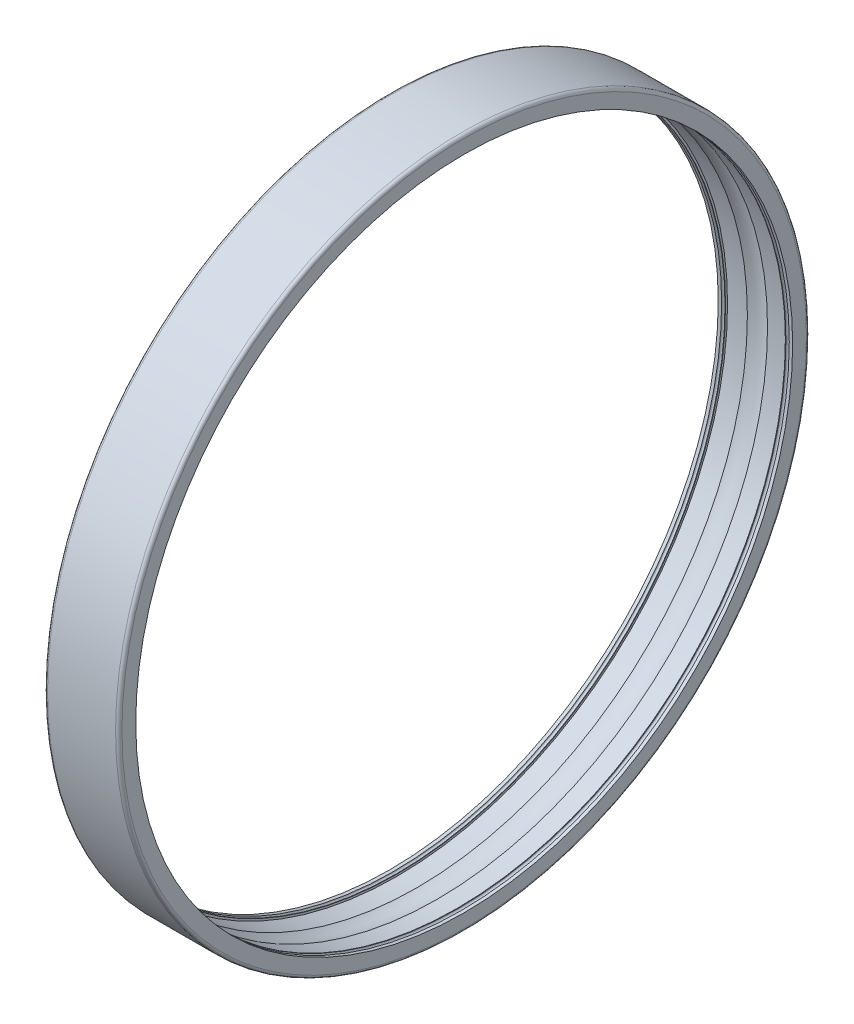
ISO-10303-21;
HEADER;
FILE_DESCRIPTION(('STEP AP214'),'2;1');
FILE_NAME('part.step','',(''),(''),'','','');
FILE_SCHEMA(('AUTOMOTIVE_DESIGN { 1 0 10303 214 1 1 1 1 }'));
ENDSEC;
DATA;
#1=APPLICATION_CONTEXT('core data for automotive mechanical design processes');
#2=APPLICATION_PROTOCOL_DEFINITION('international standard','automotive_design',2000,#1);
#3=PRODUCT_CONTEXT('',#1,'mechanical');
#4=PRODUCT('Part','Part','',(#3));
#5=PRODUCT_RELATED_PRODUCT_CATEGORY('part','',(#4));
#6=PRODUCT_DEFINITION_FORMATION('','',#4);
#7=PRODUCT_DEFINITION_CONTEXT('part definition',#1,'design');
#8=PRODUCT_DEFINITION('design','',#6,#7);
#9=PRODUCT_DEFINITION_SHAPE('','',#8);
#10=(LENGTH_UNIT() NAMED_UNIT(*) SI_UNIT(.MILLI.,.METRE.));
#11=(NAMED_UNIT(*) PLANE_ANGLE_UNIT() SI_UNIT($,.RADIAN.));
#12=(NAMED_UNIT(*) SI_UNIT($,.STERADIAN.) SOLID_ANGLE_UNIT());
#13=UNCERTAINTY_MEASURE_WITH_UNIT(LENGTH_MEASURE(1.E-05),#10,'distance_accuracy_value','');
#14=(GEOMETRIC_REPRESENTATION_CONTEXT(3) GLOBAL_UNCERTAINTY_ASSIGNED_CONTEXT((#13)) GLOBAL_UNIT_ASSIGNED_CONTEXT((#10,
#11,#12)) REPRESENTATION_CONTEXT('',''));
#15=CARTESIAN_POINT('',(0.,0.,0.));
#16=DIRECTION('',(0.,0.,1.));
#17=DIRECTION('',(1.,0.,0.));
#18=AXIS2_PLACEMENT_3D('',#15,#16,#17);
#19=CARTESIAN_POINT('',(0.,32.2,0.));
#20=DIRECTION('',(1.,0.,0.));
#21=DIRECTION('',(0.,0.,-1.));
#22=AXIS2_PLACEMENT_3D('',#19,#20,#21);
#23=PLANE('',#22);
#24=CARTESIAN_POINT('',(0.,0.,0.));
#25=DIRECTION('',(-1.,0.,0.));
#26=DIRECTION('',(0.,0.,1.));
#27=AXIS2_PLACEMENT_3D('',#24,#25,#26);
#28=CIRCLE('',#27,30.9);
#29=CARTESIAN_POINT('',(0.,0.,30.9));
#30=VERTEX_POINT('',#29);
#31=EDGE_CURVE('E9',#30,#30,#28,.T.);
#32=ORIENTED_EDGE('',*,*,#31,.F.);
#33=EDGE_LOOP('',(#32));
#34=FACE_BOUND('',#33,.T.);
#35=CARTESIAN_POINT('',(0.,0.,0.));
#36=DIRECTION('',(-1.,0.,0.));
#37=DIRECTION('',(0.,0.,1.));
#38=AXIS2_PLACEMENT_3D('',#35,#36,#37);
#39=CIRCLE('',#38,32.2);
#40=CARTESIAN_POINT('',(0.,0.,32.2));
#41=VERTEX_POINT('',#40);
#42=EDGE_CURVE('E87',#41,#41,#39,.T.);
#43=ORIENTED_EDGE('',*,*,#42,.T.);
#44=EDGE_LOOP('',(#43));
#45=FACE_BOUND('',#44,.T.);
#46=ADVANCED_FACE('F13',(#34,#45),#23,.F.);
#47=CARTESIAN_POINT('',(3.5,0.,0.));
#48=DIRECTION('',(-1.,0.,0.));
#49=DIRECTION('',(0.,0.,1.));
#50=AXIS2_PLACEMENT_3D('',#47,#48,#49);
#51=CYLINDRICAL_SURFACE('',#50,30.9);
#52=CARTESIAN_POINT('',(0.318181818181818,0.,0.));
#53=DIRECTION('',(-1.,0.,0.));
#54=DIRECTION('',(0.,0.,1.));
#55=AXIS2_PLACEMENT_3D('',#52,#53,#54);
#56=CIRCLE('',#55,30.9);
#57=CARTESIAN_POINT('',(0.318181818181818,0.,30.9));
#58=VERTEX_POINT('',#57);
#59=EDGE_CURVE('E20',#58,#58,#56,.T.);
#60=ORIENTED_EDGE('',*,*,#59,.F.);
#61=EDGE_LOOP('',(#60));
#62=FACE_BOUND('',#61,.T.);
#63=ORIENTED_EDGE('',*,*,#31,.T.);
#64=EDGE_LOOP('',(#63));
#65=FACE_BOUND('',#64,.T.);
#66=ADVANCED_FACE('F136',(#62,#65),#51,.F.);
#67=CARTESIAN_POINT('',(0.477272727272728,0.,0.));
#68=DIRECTION('',(-1.,0.,0.));
#69=DIRECTION('',(0.,0.,1.));
#70=AXIS2_PLACEMENT_3D('',#67,#68,#69);
#71=TOROIDAL_SURFACE('',#70,30.9,0.159090909090909);
#72=ORIENTED_EDGE('',*,*,#59,.T.);
#73=EDGE_LOOP('',(#72));
#74=FACE_BOUND('',#73,.T.);
#75=CARTESIAN_POINT('',(0.636363636363637,0.,0.));
#76=DIRECTION('',(-1.,0.,0.));
#77=DIRECTION('',(0.,0.,1.));
#78=AXIS2_PLACEMENT_3D('',#75,#76,#77);
#79=CIRCLE('',#78,30.9);
#80=CARTESIAN_POINT('',(0.636363636363637,0.,30.9));
#81=VERTEX_POINT('',#80);
#82=EDGE_CURVE('E29',#81,#81,#79,.T.);
#83=ORIENTED_EDGE('',*,*,#82,.F.);
#84=EDGE_LOOP('',(#83));
#85=FACE_BOUND('',#84,.T.);
#86=ADVANCED_FACE('F141',(#74,#85),#71,.F.);
#87=CARTESIAN_POINT('',(3.5,0.,0.));
#88=DIRECTION('',(-1.,0.,0.));
#89=DIRECTION('',(0.,0.,1.));
#90=AXIS2_PLACEMENT_3D('',#87,#88,#89);
#91=CYLINDRICAL_SURFACE('',#90,30.9);
#92=CARTESIAN_POINT('',(0.686363636363637,0.,0.));
#93=DIRECTION('',(-1.,0.,0.));
#94=DIRECTION('',(0.,0.,1.));
#95=AXIS2_PLACEMENT_3D('',#92,#93,#94);
#96=CIRCLE('',#95,30.9);
#97=CARTESIAN_POINT('',(0.686363636363637,0.,30.9));
#98=VERTEX_POINT('',#97);
#99=EDGE_CURVE('E37',#98,#98,#96,.T.);
#100=ORIENTED_EDGE('',*,*,#99,.F.);
#101=EDGE_LOOP('',(#100));
#102=FACE_BOUND('',#101,.T.);
#103=ORIENTED_EDGE('',*,*,#82,.T.);
#104=EDGE_LOOP('',(#103));
#105=FACE_BOUND('',#104,.T.);
#106=ADVANCED_FACE('F146',(#102,#105),#91,.F.);
#107=CARTESIAN_POINT('',(0.686363636363637,30.9,0.));
#108=DIRECTION('',(-1.,0.,0.));
#109=DIRECTION('',(0.,0.,1.));
#110=AXIS2_PLACEMENT_3D('',#107,#108,#109);
#111=PLANE('',#110);
#112=CARTESIAN_POINT('',(0.686363636363637,0.,0.));
#113=DIRECTION('',(-1.,0.,0.));
#114=DIRECTION('',(0.,0.,1.));
#115=AXIS2_PLACEMENT_3D('',#112,#113,#114);
#116=CIRCLE('',#115,31.0886363636364);
#117=CARTESIAN_POINT('',(0.686363636363637,0.,31.0886363636364));
#118=VERTEX_POINT('',#117);
#119=EDGE_CURVE('E43',#118,#118,#116,.T.);
#120=ORIENTED_EDGE('',*,*,#119,.F.);
#121=EDGE_LOOP('',(#120));
#122=FACE_BOUND('',#121,.T.);
#123=ORIENTED_EDGE('',*,*,#99,.T.);
#124=EDGE_LOOP('',(#123));
#125=FACE_BOUND('',#124,.T.);
#126=ADVANCED_FACE('F151',(#122,#125),#111,.F.);
#127=CARTESIAN_POINT('',(3.5,0.,0.));
#128=DIRECTION('',(-1.,0.,0.));
#129=DIRECTION('',(0.,0.,1.));
#130=AXIS2_PLACEMENT_3D('',#127,#128,#129);
#131=CYLINDRICAL_SURFACE('',#130,31.0886363636364);
#132=CARTESIAN_POINT('',(2.55285334986629,0.,0.));
#133=DIRECTION('',(-1.,0.,0.));
#134=DIRECTION('',(0.,0.,1.));
#135=AXIS2_PLACEMENT_3D('',#132,#133,#134);
#136=CIRCLE('',#135,31.0886363636364);
#137=CARTESIAN_POINT('',(2.55285334986629,0.,31.0886363636364));
#138=VERTEX_POINT('',#137);
#139=EDGE_CURVE('E47',#138,#138,#136,.T.);
#140=ORIENTED_EDGE('',*,*,#139,.F.);
#141=EDGE_LOOP('',(#140));
#142=FACE_BOUND('',#141,.T.);
#143=ORIENTED_EDGE('',*,*,#119,.T.);
#144=EDGE_LOOP('',(#143));
#145=FACE_BOUND('',#144,.T.);
#146=ADVANCED_FACE('F155',(#142,#145),#131,.F.);
#147=CARTESIAN_POINT('',(3.5,0.,0.));
#148=DIRECTION('',(-1.,0.,0.));
#149=DIRECTION('',(0.,0.,1.));
#150=AXIS2_PLACEMENT_3D('',#147,#148,#149);
#151=TOROIDAL_SURFACE('',#150,28.775,2.5);
#152=ORIENTED_EDGE('',*,*,#139,.T.);
#153=EDGE_LOOP('',(#152));
#154=FACE_BOUND('',#153,.T.);
#155=CARTESIAN_POINT('',(4.44714665013371,0.,0.));
#156=DIRECTION('',(-1.,0.,0.));
#157=DIRECTION('',(0.,0.,1.));
#158=AXIS2_PLACEMENT_3D('',#155,#156,#157);
#159=CIRCLE('',#158,31.0886363636364);
#160=CARTESIAN_POINT('',(4.44714665013371,0.,31.0886363636364));
#161=VERTEX_POINT('',#160);
#162=EDGE_CURVE('E51',#161,#161,#159,.T.);
#163=ORIENTED_EDGE('',*,*,#162,.F.);
#164=EDGE_LOOP('',(#163));
#165=FACE_BOUND('',#164,.T.);
#166=ADVANCED_FACE('F159',(#154,#165),#151,.F.);
#167=CARTESIAN_POINT('',(3.5,0.,0.));
#168=DIRECTION('',(-1.,0.,0.));
#169=DIRECTION('',(0.,0.,1.));
#170=AXIS2_PLACEMENT_3D('',#167,#168,#169);
#171=CYLINDRICAL_SURFACE('',#170,31.0886363636364);
#172=CARTESIAN_POINT('',(6.31363636363637,0.,0.));
#173=DIRECTION('',(-1.,0.,0.));
#174=DIRECTION('',(0.,0.,1.));
#175=AXIS2_PLACEMENT_3D('',#172,#173,#174);
#176=CIRCLE('',#175,31.0886363636364);
#177=CARTESIAN_POINT('',(6.31363636363637,0.,31.0886363636364));
#178=VERTEX_POINT('',#177);
#179=EDGE_CURVE('E55',#178,#178,#176,.T.);
#180=ORIENTED_EDGE('',*,*,#179,.F.);
#181=EDGE_LOOP('',(#180));
#182=FACE_BOUND('',#181,.T.);
#183=ORIENTED_EDGE('',*,*,#162,.T.);
#184=EDGE_LOOP('',(#183));
#185=FACE_BOUND('',#184,.T.);
#186=ADVANCED_FACE('F163',(#182,#185),#171,.F.);
#187=CARTESIAN_POINT('',(6.31363636363637,31.0886363636364,0.));
#188=DIRECTION('',(1.,0.,0.));
#189=DIRECTION('',(0.,0.,-1.));
#190=AXIS2_PLACEMENT_3D('',#187,#188,#189);
#191=PLANE('',#190);
#192=CARTESIAN_POINT('',(6.31363636363636,0.,0.));
#193=DIRECTION('',(-1.,0.,0.));
#194=DIRECTION('',(0.,0.,1.));
#195=AXIS2_PLACEMENT_3D('',#192,#193,#194);
#196=CIRCLE('',#195,30.9);
#197=CARTESIAN_POINT('',(6.31363636363636,0.,30.9));
#198=VERTEX_POINT('',#197);
#199=EDGE_CURVE('E59',#198,#198,#196,.T.);
#200=ORIENTED_EDGE('',*,*,#199,.F.);
#201=EDGE_LOOP('',(#200));
#202=FACE_BOUND('',#201,.T.);
#203=ORIENTED_EDGE('',*,*,#179,.T.);
#204=EDGE_LOOP('',(#203));
#205=FACE_BOUND('',#204,.T.);
#206=ADVANCED_FACE('F132',(#202,#205),#191,.F.);
#207=CARTESIAN_POINT('',(3.5,0.,0.));
#208=DIRECTION('',(-1.,0.,0.));
#209=DIRECTION('',(0.,0.,1.));
#210=AXIS2_PLACEMENT_3D('',#207,#208,#209);
#211=CYLINDRICAL_SURFACE('',#210,30.9);
#212=CARTESIAN_POINT('',(6.36363636363636,0.,0.));
#213=DIRECTION('',(-1.,0.,0.));
#214=DIRECTION('',(0.,0.,1.));
#215=AXIS2_PLACEMENT_3D('',#212,#213,#214);
#216=CIRCLE('',#215,30.9);
#217=CARTESIAN_POINT('',(6.36363636363636,0.,30.9));
#218=VERTEX_POINT('',#217);
#219=EDGE_CURVE('E63',#218,#218,#216,.T.);
#220=ORIENTED_EDGE('',*,*,#219,.F.);
#221=EDGE_LOOP('',(#220));
#222=FACE_BOUND('',#221,.T.);
#223=ORIENTED_EDGE('',*,*,#199,.T.);
#224=EDGE_LOOP('',(#223));
#225=FACE_BOUND('',#224,.T.);
#226=ADVANCED_FACE('F125',(#222,#225),#211,.F.);
#227=CARTESIAN_POINT('',(6.52272727272727,0.,0.));
#228=DIRECTION('',(-1.,0.,0.));
#229=DIRECTION('',(0.,0.,1.));
#230=AXIS2_PLACEMENT_3D('',#227,#228,#229);
#231=TOROIDAL_SURFACE('',#230,30.9,0.159090909090909);
#232=ORIENTED_EDGE('',*,*,#219,.T.);
#233=EDGE_LOOP('',(#232));
#234=FACE_BOUND('',#233,.T.);
#235=CARTESIAN_POINT('',(6.68181818181818,0.,0.));
#236=DIRECTION('',(-1.,0.,0.));
#237=DIRECTION('',(0.,0.,1.));
#238=AXIS2_PLACEMENT_3D('',#235,#236,#237);
#239=CIRCLE('',#238,30.9);
#240=CARTESIAN_POINT('',(6.68181818181818,0.,30.9));
#241=VERTEX_POINT('',#240);
#242=EDGE_CURVE('E67',#241,#241,#239,.T.);
#243=ORIENTED_EDGE('',*,*,#242,.F.);
#244=EDGE_LOOP('',(#243));
#245=FACE_BOUND('',#244,.T.);
#246=ADVANCED_FACE('F120',(#234,#245),#231,.F.);
#247=CARTESIAN_POINT('',(3.5,0.,0.));
#248=DIRECTION('',(-1.,0.,0.));
#249=DIRECTION('',(0.,0.,1.));
#250=AXIS2_PLACEMENT_3D('',#247,#248,#249);
#251=CYLINDRICAL_SURFACE('',#250,30.9);
#252=CARTESIAN_POINT('',(7.,0.,0.));
#253=DIRECTION('',(-1.,0.,0.));
#254=DIRECTION('',(0.,0.,1.));
#255=AXIS2_PLACEMENT_3D('',#252,#253,#254);
#256=CIRCLE('',#255,30.9);
#257=CARTESIAN_POINT('',(7.,0.,30.9));
#258=VERTEX_POINT('',#257);
#259=EDGE_CURVE('E71',#258,#258,#256,.T.);
#260=ORIENTED_EDGE('',*,*,#259,.F.);
#261=EDGE_LOOP('',(#260));
#262=FACE_BOUND('',#261,.T.);
#263=ORIENTED_EDGE('',*,*,#242,.T.);
#264=EDGE_LOOP('',(#263));
#265=FACE_BOUND('',#264,.T.);
#266=ADVANCED_FACE('F114',(#262,#265),#251,.F.);
#267=CARTESIAN_POINT('',(7.,30.9,0.));
#268=DIRECTION('',(-1.,0.,0.));
#269=DIRECTION('',(0.,0.,1.));
#270=AXIS2_PLACEMENT_3D('',#267,#268,#269);
#271=PLANE('',#270);
#272=CARTESIAN_POINT('',(7.,0.,0.));
#273=DIRECTION('',(-1.,0.,0.));
#274=DIRECTION('',(0.,0.,1.));
#275=AXIS2_PLACEMENT_3D('',#272,#273,#274);
#276=CIRCLE('',#275,32.2);
#277=CARTESIAN_POINT('',(7.,0.,32.2));
#278=VERTEX_POINT('',#277);
#279=EDGE_CURVE('E75',#278,#278,#276,.T.);
#280=ORIENTED_EDGE('',*,*,#279,.F.);
#281=EDGE_LOOP('',(#280));
#282=FACE_BOUND('',#281,.T.);
#283=ORIENTED_EDGE('',*,*,#259,.T.);
#284=EDGE_LOOP('',(#283));
#285=FACE_BOUND('',#284,.T.);
#286=ADVANCED_FACE('F108',(#282,#285),#271,.F.);
#287=CARTESIAN_POINT('',(6.7,0.,0.));
#288=DIRECTION('',(-1.,0.,0.));
#289=DIRECTION('',(0.,0.,1.));
#290=AXIS2_PLACEMENT_3D('',#287,#288,#289);
#291=TOROIDAL_SURFACE('',#290,32.2,0.3);
#292=CARTESIAN_POINT('',(6.7,0.,0.));
#293=DIRECTION('',(-1.,0.,0.));
#294=DIRECTION('',(0.,0.,1.));
#295=AXIS2_PLACEMENT_3D('',#292,#293,#294);
#296=CIRCLE('',#295,32.5);
#297=CARTESIAN_POINT('',(6.7,0.,32.5));
#298=VERTEX_POINT('',#297);
#299=EDGE_CURVE('E79',#298,#298,#296,.T.);
#300=ORIENTED_EDGE('',*,*,#299,.F.);
#301=EDGE_LOOP('',(#300));
#302=FACE_BOUND('',#301,.T.);
#303=ORIENTED_EDGE('',*,*,#279,.T.);
#304=EDGE_LOOP('',(#303));
#305=FACE_BOUND('',#304,.T.);
#306=ADVANCED_FACE('F102',(#302,#305),#291,.T.);
#307=CARTESIAN_POINT('',(3.5,0.,0.));
#308=DIRECTION('',(-1.,0.,0.));
#309=DIRECTION('',(0.,0.,1.));
#310=AXIS2_PLACEMENT_3D('',#307,#308,#309);
#311=CYLINDRICAL_SURFACE('',#310,32.5);
#312=CARTESIAN_POINT('',(0.3,0.,0.));
#313=DIRECTION('',(-1.,0.,0.));
#314=DIRECTION('',(0.,0.,1.));
#315=AXIS2_PLACEMENT_3D('',#312,#313,#314);
#316=CIRCLE('',#315,32.5);
#317=CARTESIAN_POINT('',(0.3,0.,32.5));
#318=VERTEX_POINT('',#317);
#319=EDGE_CURVE('E83',#318,#318,#316,.T.);
#320=ORIENTED_EDGE('',*,*,#319,.F.);
#321=EDGE_LOOP('',(#320));
#322=FACE_BOUND('',#321,.T.);
#323=ORIENTED_EDGE('',*,*,#299,.T.);
#324=EDGE_LOOP('',(#323));
#325=FACE_BOUND('',#324,.T.);
#326=ADVANCED_FACE('F96',(#322,#325),#311,.T.);
#327=CARTESIAN_POINT('',(0.3,0.,0.));
#328=DIRECTION('',(-1.,0.,0.));
#329=DIRECTION('',(0.,0.,1.));
#330=AXIS2_PLACEMENT_3D('',#327,#328,#329);
#331=TOROIDAL_SURFACE('',#330,32.2,0.3);
#332=ORIENTED_EDGE('',*,*,#42,.F.);
#333=EDGE_LOOP('',(#332));
#334=FACE_BOUND('',#333,.T.);
#335=ORIENTED_EDGE('',*,*,#319,.T.);
#336=EDGE_LOOP('',(#335));
#337=FACE_BOUND('',#336,.T.);
#338=ADVANCED_FACE('F93',(#334,#337),#331,.T.);
#339=CLOSED_SHELL('',(#46,#66,#86,#106,#126,#146,#166,#186,#206,#226,#246,#266,#286,#306,#326,#338));
#340=MANIFOLD_SOLID_BREP('B1',#339);
#341=ADVANCED_BREP_SHAPE_REPRESENTATION('',(#18,#340),#14);
#342=SHAPE_DEFINITION_REPRESENTATION(#9,#341);
ENDSEC;
END-ISO-10303-21;
